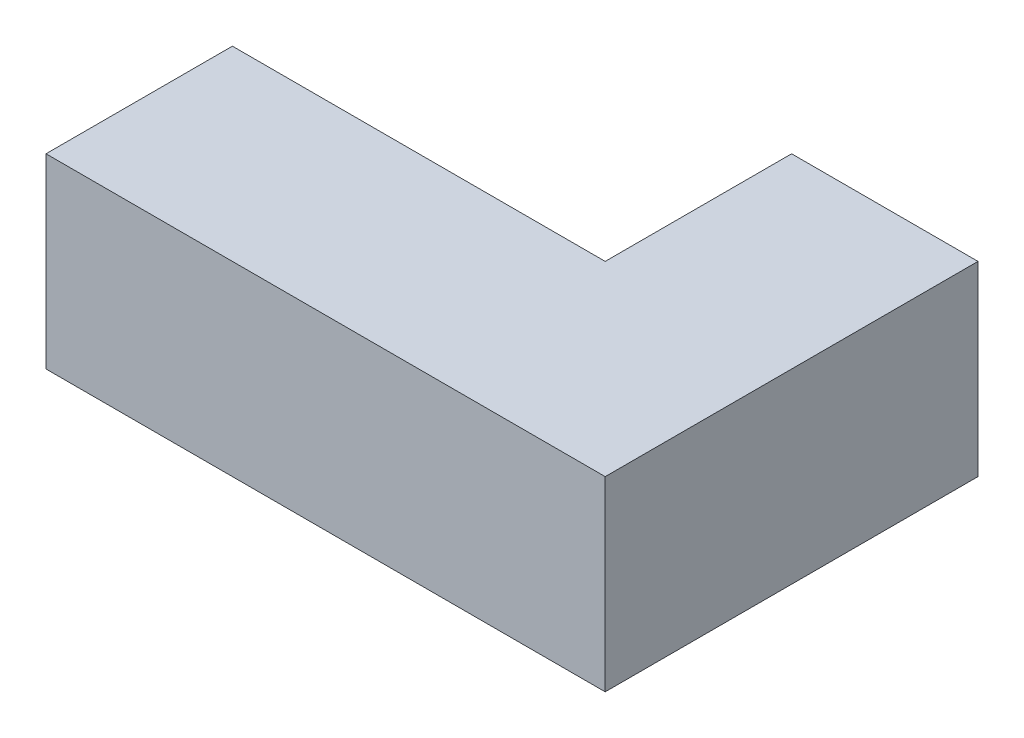
ISO-10303-21;
HEADER;
FILE_DESCRIPTION(('STEP AP214'),'2;1');
FILE_NAME('part.step','',(''),(''),'','','');
FILE_SCHEMA(('AUTOMOTIVE_DESIGN { 1 0 10303 214 1 1 1 1 }'));
ENDSEC;
DATA;
#1=APPLICATION_CONTEXT('core data for automotive mechanical design processes');
#2=APPLICATION_PROTOCOL_DEFINITION('international standard','automotive_design',2000,#1);
#3=PRODUCT_CONTEXT('',#1,'mechanical');
#4=PRODUCT('Part','Part','',(#3));
#5=PRODUCT_RELATED_PRODUCT_CATEGORY('part','',(#4));
#6=PRODUCT_DEFINITION_FORMATION('','',#4);
#7=PRODUCT_DEFINITION_CONTEXT('part definition',#1,'design');
#8=PRODUCT_DEFINITION('design','',#6,#7);
#9=PRODUCT_DEFINITION_SHAPE('','',#8);
#10=(LENGTH_UNIT() NAMED_UNIT(*) SI_UNIT(.MILLI.,.METRE.));
#11=(NAMED_UNIT(*) PLANE_ANGLE_UNIT() SI_UNIT($,.RADIAN.));
#12=(NAMED_UNIT(*) SI_UNIT($,.STERADIAN.) SOLID_ANGLE_UNIT());
#13=UNCERTAINTY_MEASURE_WITH_UNIT(LENGTH_MEASURE(1.E-05),#10,'distance_accuracy_value','');
#14=(GEOMETRIC_REPRESENTATION_CONTEXT(3) GLOBAL_UNCERTAINTY_ASSIGNED_CONTEXT((#13)) GLOBAL_UNIT_ASSIGNED_CONTEXT((#10,
#11,#12)) REPRESENTATION_CONTEXT('',''));
#15=CARTESIAN_POINT('',(0.,0.,0.));
#16=DIRECTION('',(0.,0.,1.));
#17=DIRECTION('',(1.,0.,0.));
#18=AXIS2_PLACEMENT_3D('',#15,#16,#17);
#19=CARTESIAN_POINT('',(0.,30.,0.));
#20=DIRECTION('',(1.,0.,0.));
#21=DIRECTION('',(0.,0.,-1.));
#22=AXIS2_PLACEMENT_3D('',#19,#20,#21);
#23=PLANE('',#22);
#24=DIRECTION('',(0.,0.,1.));
#25=VECTOR('',#24,1.);
#26=CARTESIAN_POINT('',(0.,0.,0.));
#27=LINE('',#26,#25);
#28=CARTESIAN_POINT('',(0.,0.,-30.));
#29=VERTEX_POINT('',#28);
#30=CARTESIAN_POINT('',(0.,0.,0.));
#31=VERTEX_POINT('',#30);
#32=EDGE_CURVE('E123',#29,#31,#27,.T.);
#33=ORIENTED_EDGE('',*,*,#32,.T.);
#34=DIRECTION('',(0.,-1.,0.));
#35=VECTOR('',#34,1.);
#36=CARTESIAN_POINT('',(0.,30.,0.));
#37=LINE('',#36,#35);
#38=CARTESIAN_POINT('',(0.,30.,0.));
#39=VERTEX_POINT('',#38);
#40=EDGE_CURVE('E11',#39,#31,#37,.T.);
#41=ORIENTED_EDGE('',*,*,#40,.F.);
#42=DIRECTION('',(0.,0.,1.));
#43=VECTOR('',#42,1.);
#44=CARTESIAN_POINT('',(0.,30.,0.));
#45=LINE('',#44,#43);
#46=CARTESIAN_POINT('',(0.,30.,-30.));
#47=VERTEX_POINT('',#46);
#48=EDGE_CURVE('E133',#47,#39,#45,.T.);
#49=ORIENTED_EDGE('',*,*,#48,.F.);
#50=DIRECTION('',(0.,-1.,0.));
#51=VECTOR('',#50,1.);
#52=CARTESIAN_POINT('',(0.,30.,-30.));
#53=LINE('',#52,#51);
#54=EDGE_CURVE('E119',#47,#29,#53,.T.);
#55=ORIENTED_EDGE('',*,*,#54,.T.);
#56=EDGE_LOOP('',(#33,#41,#49,#55));
#57=FACE_BOUND('',#56,.T.);
#58=ADVANCED_FACE('F39',(#57),#23,.F.);
#59=CARTESIAN_POINT('',(0.,30.,0.));
#60=DIRECTION('',(0.,0.,-1.));
#61=DIRECTION('',(-1.,0.,0.));
#62=AXIS2_PLACEMENT_3D('',#59,#60,#61);
#63=PLANE('',#62);
#64=DIRECTION('',(1.,0.,0.));
#65=VECTOR('',#64,1.);
#66=CARTESIAN_POINT('',(0.,0.,0.));
#67=LINE('',#66,#65);
#68=CARTESIAN_POINT('',(90.,0.,0.));
#69=VERTEX_POINT('',#68);
#70=EDGE_CURVE('E126',#31,#69,#67,.T.);
#71=ORIENTED_EDGE('',*,*,#70,.T.);
#72=DIRECTION('',(0.,-1.,0.));
#73=VECTOR('',#72,1.);
#74=CARTESIAN_POINT('',(90.,30.,0.));
#75=LINE('',#74,#73);
#76=CARTESIAN_POINT('',(90.,30.,0.));
#77=VERTEX_POINT('',#76);
#78=EDGE_CURVE('E47',#77,#69,#75,.T.);
#79=ORIENTED_EDGE('',*,*,#78,.F.);
#80=DIRECTION('',(1.,0.,0.));
#81=VECTOR('',#80,1.);
#82=CARTESIAN_POINT('',(0.,30.,0.));
#83=LINE('',#82,#81);
#84=EDGE_CURVE('E92',#39,#77,#83,.T.);
#85=ORIENTED_EDGE('',*,*,#84,.F.);
#86=ORIENTED_EDGE('',*,*,#40,.T.);
#87=EDGE_LOOP('',(#71,#79,#85,#86));
#88=FACE_BOUND('',#87,.T.);
#89=ADVANCED_FACE('F157',(#88),#63,.F.);
#90=CARTESIAN_POINT('',(90.,30.,0.));
#91=DIRECTION('',(-1.,0.,0.));
#92=DIRECTION('',(0.,0.,1.));
#93=AXIS2_PLACEMENT_3D('',#90,#91,#92);
#94=PLANE('',#93);
#95=DIRECTION('',(0.,0.,-1.));
#96=VECTOR('',#95,1.);
#97=CARTESIAN_POINT('',(90.,0.,0.));
#98=LINE('',#97,#96);
#99=CARTESIAN_POINT('',(90.,0.,-60.));
#100=VERTEX_POINT('',#99);
#101=EDGE_CURVE('E128',#69,#100,#98,.T.);
#102=ORIENTED_EDGE('',*,*,#101,.T.);
#103=DIRECTION('',(0.,-1.,0.));
#104=VECTOR('',#103,1.);
#105=CARTESIAN_POINT('',(90.,30.,-60.));
#106=LINE('',#105,#104);
#107=CARTESIAN_POINT('',(90.,30.,-60.));
#108=VERTEX_POINT('',#107);
#109=EDGE_CURVE('E114',#108,#100,#106,.T.);
#110=ORIENTED_EDGE('',*,*,#109,.F.);
#111=DIRECTION('',(0.,0.,-1.));
#112=VECTOR('',#111,1.);
#113=CARTESIAN_POINT('',(90.,30.,0.));
#114=LINE('',#113,#112);
#115=EDGE_CURVE('E105',#77,#108,#114,.T.);
#116=ORIENTED_EDGE('',*,*,#115,.F.);
#117=ORIENTED_EDGE('',*,*,#78,.T.);
#118=EDGE_LOOP('',(#102,#110,#116,#117));
#119=FACE_BOUND('',#118,.T.);
#120=ADVANCED_FACE('F139',(#119),#94,.F.);
#121=CARTESIAN_POINT('',(90.,30.,-60.));
#122=DIRECTION('',(0.,0.,1.));
#123=DIRECTION('',(1.,0.,0.));
#124=AXIS2_PLACEMENT_3D('',#121,#122,#123);
#125=PLANE('',#124);
#126=DIRECTION('',(-1.,0.,0.));
#127=VECTOR('',#126,1.);
#128=CARTESIAN_POINT('',(90.,0.,-60.));
#129=LINE('',#128,#127);
#130=CARTESIAN_POINT('',(60.,0.,-60.));
#131=VERTEX_POINT('',#130);
#132=EDGE_CURVE('E113',#100,#131,#129,.T.);
#133=ORIENTED_EDGE('',*,*,#132,.T.);
#134=DIRECTION('',(0.,-1.,0.));
#135=VECTOR('',#134,1.);
#136=CARTESIAN_POINT('',(60.,30.,-60.));
#137=LINE('',#136,#135);
#138=CARTESIAN_POINT('',(60.,30.,-60.));
#139=VERTEX_POINT('',#138);
#140=EDGE_CURVE('E110',#139,#131,#137,.T.);
#141=ORIENTED_EDGE('',*,*,#140,.F.);
#142=DIRECTION('',(-1.,0.,0.));
#143=VECTOR('',#142,1.);
#144=CARTESIAN_POINT('',(90.,30.,-60.));
#145=LINE('',#144,#143);
#146=EDGE_CURVE('E99',#108,#139,#145,.T.);
#147=ORIENTED_EDGE('',*,*,#146,.F.);
#148=ORIENTED_EDGE('',*,*,#109,.T.);
#149=EDGE_LOOP('',(#133,#141,#147,#148));
#150=FACE_BOUND('',#149,.T.);
#151=ADVANCED_FACE('F111',(#150),#125,.F.);
#152=CARTESIAN_POINT('',(60.,30.,-60.));
#153=DIRECTION('',(1.,0.,0.));
#154=DIRECTION('',(0.,0.,-1.));
#155=AXIS2_PLACEMENT_3D('',#152,#153,#154);
#156=PLANE('',#155);
#157=DIRECTION('',(0.,0.,1.));
#158=VECTOR('',#157,1.);
#159=CARTESIAN_POINT('',(60.,0.,-60.));
#160=LINE('',#159,#158);
#161=CARTESIAN_POINT('',(60.,0.,-30.));
#162=VERTEX_POINT('',#161);
#163=EDGE_CURVE('E78',#131,#162,#160,.T.);
#164=ORIENTED_EDGE('',*,*,#163,.T.);
#165=DIRECTION('',(0.,-1.,0.));
#166=VECTOR('',#165,1.);
#167=CARTESIAN_POINT('',(60.,30.,-30.));
#168=LINE('',#167,#166);
#169=CARTESIAN_POINT('',(60.,30.,-30.));
#170=VERTEX_POINT('',#169);
#171=EDGE_CURVE('E115',#170,#162,#168,.T.);
#172=ORIENTED_EDGE('',*,*,#171,.F.);
#173=DIRECTION('',(0.,0.,1.));
#174=VECTOR('',#173,1.);
#175=CARTESIAN_POINT('',(60.,30.,-60.));
#176=LINE('',#175,#174);
#177=EDGE_CURVE('E103',#139,#170,#176,.T.);
#178=ORIENTED_EDGE('',*,*,#177,.F.);
#179=ORIENTED_EDGE('',*,*,#140,.T.);
#180=EDGE_LOOP('',(#164,#172,#178,#179));
#181=FACE_BOUND('',#180,.T.);
#182=ADVANCED_FACE('F117',(#181),#156,.F.);
#183=CARTESIAN_POINT('',(0.,30.,-30.));
#184=DIRECTION('',(0.,0.,1.));
#185=DIRECTION('',(1.,0.,0.));
#186=AXIS2_PLACEMENT_3D('',#183,#184,#185);
#187=PLANE('',#186);
#188=DIRECTION('',(-1.,0.,0.));
#189=VECTOR('',#188,1.);
#190=CARTESIAN_POINT('',(0.,0.,-30.));
#191=LINE('',#190,#189);
#192=EDGE_CURVE('E84',#162,#29,#191,.T.);
#193=ORIENTED_EDGE('',*,*,#192,.T.);
#194=ORIENTED_EDGE('',*,*,#54,.F.);
#195=DIRECTION('',(-1.,0.,0.));
#196=VECTOR('',#195,1.);
#197=CARTESIAN_POINT('',(0.,30.,-30.));
#198=LINE('',#197,#196);
#199=EDGE_CURVE('E55',#170,#47,#198,.T.);
#200=ORIENTED_EDGE('',*,*,#199,.F.);
#201=ORIENTED_EDGE('',*,*,#171,.T.);
#202=EDGE_LOOP('',(#193,#194,#200,#201));
#203=FACE_BOUND('',#202,.T.);
#204=ADVANCED_FACE('F146',(#203),#187,.F.);
#205=CARTESIAN_POINT('',(0.,30.,0.));
#206=DIRECTION('',(0.,-1.,0.));
#207=DIRECTION('',(0.,0.,-1.));
#208=AXIS2_PLACEMENT_3D('',#205,#206,#207);
#209=PLANE('',#208);
#210=ORIENTED_EDGE('',*,*,#48,.T.);
#211=ORIENTED_EDGE('',*,*,#84,.T.);
#212=ORIENTED_EDGE('',*,*,#115,.T.);
#213=ORIENTED_EDGE('',*,*,#146,.T.);
#214=ORIENTED_EDGE('',*,*,#177,.T.);
#215=ORIENTED_EDGE('',*,*,#199,.T.);
#216=EDGE_LOOP('',(#210,#211,#212,#213,#214,#215));
#217=FACE_BOUND('',#216,.T.);
#218=ADVANCED_FACE('F101',(#217),#209,.F.);
#219=CARTESIAN_POINT('',(0.,0.,0.));
#220=DIRECTION('',(0.,-1.,0.));
#221=DIRECTION('',(0.,0.,-1.));
#222=AXIS2_PLACEMENT_3D('',#219,#220,#221);
#223=PLANE('',#222);
#224=ORIENTED_EDGE('',*,*,#32,.F.);
#225=ORIENTED_EDGE('',*,*,#192,.F.);
#226=ORIENTED_EDGE('',*,*,#163,.F.);
#227=ORIENTED_EDGE('',*,*,#132,.F.);
#228=ORIENTED_EDGE('',*,*,#101,.F.);
#229=ORIENTED_EDGE('',*,*,#70,.F.);
#230=EDGE_LOOP('',(#224,#225,#226,#227,#228,#229));
#231=FACE_BOUND('',#230,.T.);
#232=ADVANCED_FACE('F142',(#231),#223,.T.);
#233=CLOSED_SHELL('',(#58,#89,#120,#151,#182,#204,#218,#232));
#234=MANIFOLD_SOLID_BREP('B2',#233);
#235=ADVANCED_BREP_SHAPE_REPRESENTATION('',(#18,#234),#14);
#236=SHAPE_DEFINITION_REPRESENTATION(#9,#235);
ENDSEC;
END-ISO-10303-21;
